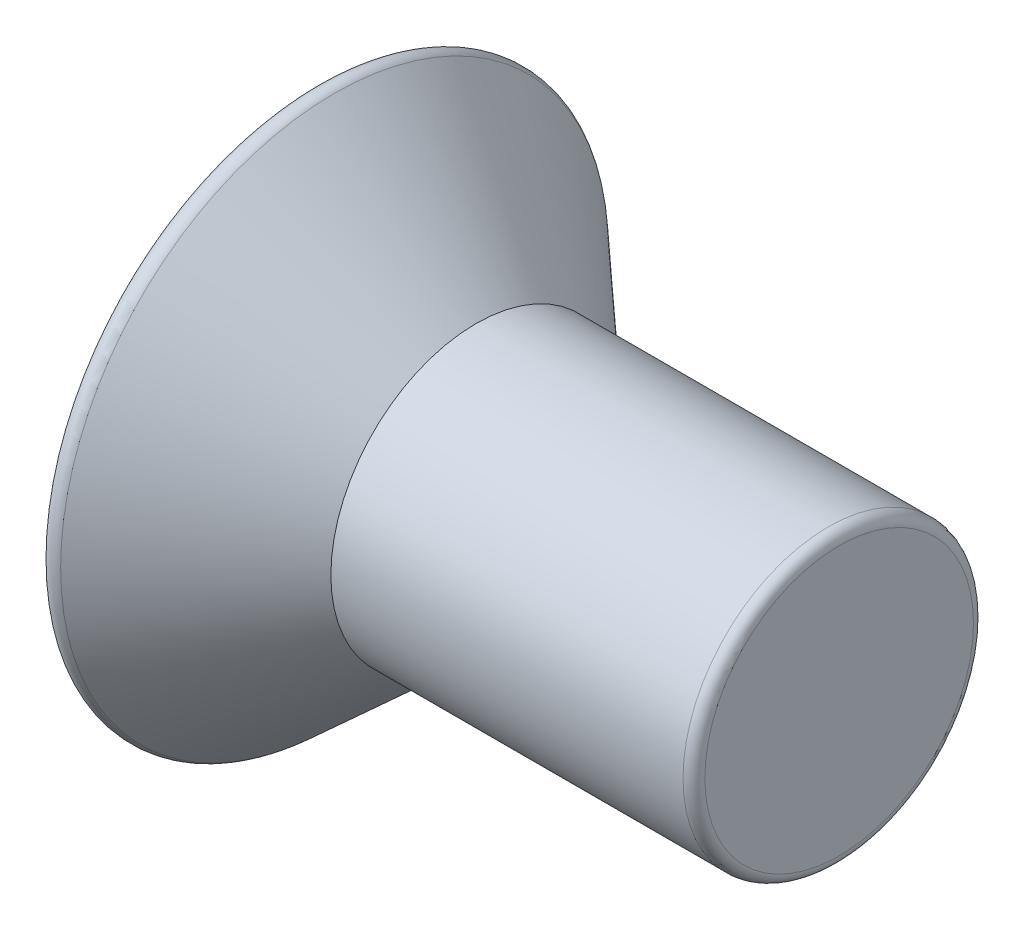
ISO-10303-21;
HEADER;
FILE_DESCRIPTION(('STEP AP214'),'2;1');
FILE_NAME('part.step','',(''),(''),'','','');
FILE_SCHEMA(('AUTOMOTIVE_DESIGN { 1 0 10303 214 1 1 1 1 }'));
ENDSEC;
DATA;
#1=APPLICATION_CONTEXT('core data for automotive mechanical design processes');
#2=APPLICATION_PROTOCOL_DEFINITION('international standard','automotive_design',2000,#1);
#3=PRODUCT_CONTEXT('',#1,'mechanical');
#4=PRODUCT('Part','Part','',(#3));
#5=PRODUCT_RELATED_PRODUCT_CATEGORY('part','',(#4));
#6=PRODUCT_DEFINITION_FORMATION('','',#4);
#7=PRODUCT_DEFINITION_CONTEXT('part definition',#1,'design');
#8=PRODUCT_DEFINITION('design','',#6,#7);
#9=PRODUCT_DEFINITION_SHAPE('','',#8);
#10=(LENGTH_UNIT() NAMED_UNIT(*) SI_UNIT(.MILLI.,.METRE.));
#11=(NAMED_UNIT(*) PLANE_ANGLE_UNIT() SI_UNIT($,.RADIAN.));
#12=(NAMED_UNIT(*) SI_UNIT($,.STERADIAN.) SOLID_ANGLE_UNIT());
#13=UNCERTAINTY_MEASURE_WITH_UNIT(LENGTH_MEASURE(1.E-05),#10,'distance_accuracy_value','');
#14=(GEOMETRIC_REPRESENTATION_CONTEXT(3) GLOBAL_UNCERTAINTY_ASSIGNED_CONTEXT((#13)) GLOBAL_UNIT_ASSIGNED_CONTEXT((#10,
#11,#12)) REPRESENTATION_CONTEXT('',''));
#15=CARTESIAN_POINT('',(0.,0.,0.));
#16=DIRECTION('',(0.,0.,1.));
#17=DIRECTION('',(1.,0.,0.));
#18=AXIS2_PLACEMENT_3D('',#15,#16,#17);
#19=CARTESIAN_POINT('',(0.,0.,0.));
#20=DIRECTION('',(-1.,0.,0.));
#21=DIRECTION('',(0.,0.,1.));
#22=AXIS2_PLACEMENT_3D('',#19,#20,#21);
#23=PLANE('',#22);
#24=CARTESIAN_POINT('',(0.,0.,0.));
#25=DIRECTION('',(-1.,0.,0.));
#26=DIRECTION('',(0.,0.,1.));
#27=AXIS2_PLACEMENT_3D('',#24,#25,#26);
#28=CIRCLE('',#27,3.7);
#29=CARTESIAN_POINT('',(0.,0.,3.7));
#30=VERTEX_POINT('',#29);
#31=EDGE_CURVE('E151',#30,#30,#28,.F.);
#32=ORIENTED_EDGE('',*,*,#31,.T.);
#33=EDGE_LOOP('',(#32));
#34=FACE_BOUND('',#33,.T.);
#35=ADVANCED_FACE('F38',(#34),#23,.F.);
#36=CARTESIAN_POINT('',(-14.4,0.,0.));
#37=DIRECTION('',(-1.,0.,0.));
#38=DIRECTION('',(0.,0.,1.));
#39=AXIS2_PLACEMENT_3D('',#36,#37,#38);
#40=CYLINDRICAL_SURFACE('',#39,4.);
#41=CARTESIAN_POINT('',(-0.3,0.,0.));
#42=DIRECTION('',(-1.,0.,0.));
#43=DIRECTION('',(0.,0.,1.));
#44=AXIS2_PLACEMENT_3D('',#41,#42,#43);
#45=CIRCLE('',#44,4.);
#46=CARTESIAN_POINT('',(-0.3,0.,4.));
#47=VERTEX_POINT('',#46);
#48=EDGE_CURVE('E148',#47,#47,#45,.T.);
#49=ORIENTED_EDGE('',*,*,#48,.T.);
#50=EDGE_LOOP('',(#49));
#51=FACE_BOUND('',#50,.T.);
#52=CARTESIAN_POINT('',(-10.,0.,0.));
#53=DIRECTION('',(-1.,0.,0.));
#54=DIRECTION('',(0.,0.,1.));
#55=AXIS2_PLACEMENT_3D('',#52,#53,#54);
#56=CIRCLE('',#55,4.);
#57=CARTESIAN_POINT('',(-10.,0.,4.));
#58=VERTEX_POINT('',#57);
#59=EDGE_CURVE('E140',#58,#58,#56,.T.);
#60=ORIENTED_EDGE('',*,*,#59,.F.);
#61=EDGE_LOOP('',(#60));
#62=FACE_BOUND('',#61,.T.);
#63=ADVANCED_FACE('F168',(#51,#62),#40,.T.);
#64=CARTESIAN_POINT('',(-10.,0.,0.));
#65=DIRECTION('',(-1.,0.,0.));
#66=DIRECTION('',(0.,0.,1.));
#67=AXIS2_PLACEMENT_3D('',#64,#65,#66);
#68=CONICAL_SURFACE('',#67,4.,0.737815060120465);
#69=CARTESIAN_POINT('',(-13.8981981618011,0.,0.));
#70=DIRECTION('',(1.,0.,0.));
#71=DIRECTION('',(0.,0.,-1.));
#72=AXIS2_PLACEMENT_3D('',#69,#70,#71);
#73=CIRCLE('',#72,7.54381651072828);
#74=CARTESIAN_POINT('',(-13.8981981618011,0.,-7.54381651072828));
#75=VERTEX_POINT('',#74);
#76=EDGE_CURVE('E11',#75,#75,#73,.T.);
#77=ORIENTED_EDGE('',*,*,#76,.T.);
#78=EDGE_LOOP('',(#77));
#79=FACE_BOUND('',#78,.T.);
#80=ORIENTED_EDGE('',*,*,#59,.T.);
#81=EDGE_LOOP('',(#80));
#82=FACE_BOUND('',#81,.T.);
#83=ADVANCED_FACE('F174',(#79,#82),#68,.T.);
#84=CARTESIAN_POINT('',(-14.4,8.,0.));
#85=DIRECTION('',(1.,0.,0.));
#86=DIRECTION('',(0.,0.,-1.));
#87=AXIS2_PLACEMENT_3D('',#84,#85,#86);
#88=PLANE('',#87);
#89=CARTESIAN_POINT('',(-14.4,0.,0.));
#90=DIRECTION('',(1.,0.,0.));
#91=DIRECTION('',(0.,0.,-1.));
#92=AXIS2_PLACEMENT_3D('',#89,#90,#91);
#93=CIRCLE('',#92,7.3218344887095);
#94=CARTESIAN_POINT('',(-14.4,0.,-7.3218344887095));
#95=VERTEX_POINT('',#94);
#96=EDGE_CURVE('E46',#95,#95,#93,.F.);
#97=ORIENTED_EDGE('',*,*,#96,.T.);
#98=EDGE_LOOP('',(#97));
#99=FACE_BOUND('',#98,.T.);
#100=DIRECTION('',(0.,0.866025403784438,-0.5));
#101=VECTOR('',#100,1.);
#102=CARTESIAN_POINT('',(-14.4,0.,2.88675134594813));
#103=LINE('',#102,#101);
#104=CARTESIAN_POINT('',(-14.4,0.,2.88675134594813));
#105=VERTEX_POINT('',#104);
#106=CARTESIAN_POINT('',(-14.4,2.5,1.44337567297406));
#107=VERTEX_POINT('',#106);
#108=EDGE_CURVE('E127',#105,#107,#103,.T.);
#109=ORIENTED_EDGE('',*,*,#108,.F.);
#110=DIRECTION('',(0.,0.866025403784439,0.5));
#111=VECTOR('',#110,1.);
#112=CARTESIAN_POINT('',(-14.4,-2.5,1.44337567297406));
#113=LINE('',#112,#111);
#114=CARTESIAN_POINT('',(-14.4,-2.5,1.44337567297406));
#115=VERTEX_POINT('',#114);
#116=EDGE_CURVE('E53',#115,#105,#113,.T.);
#117=ORIENTED_EDGE('',*,*,#116,.F.);
#118=DIRECTION('',(0.,0.,1.));
#119=VECTOR('',#118,1.);
#120=CARTESIAN_POINT('',(-14.4,-2.5,-1.44337567297407));
#121=LINE('',#120,#119);
#122=CARTESIAN_POINT('',(-14.4,-2.5,-1.44337567297407));
#123=VERTEX_POINT('',#122);
#124=EDGE_CURVE('E136',#123,#115,#121,.T.);
#125=ORIENTED_EDGE('',*,*,#124,.F.);
#126=DIRECTION('',(0.,-0.866025403784439,0.5));
#127=VECTOR('',#126,1.);
#128=CARTESIAN_POINT('',(-14.4,0.,-2.88675134594813));
#129=LINE('',#128,#127);
#130=CARTESIAN_POINT('',(-14.4,0.,-2.88675134594813));
#131=VERTEX_POINT('',#130);
#132=EDGE_CURVE('E134',#131,#123,#129,.T.);
#133=ORIENTED_EDGE('',*,*,#132,.F.);
#134=DIRECTION('',(0.,-0.866025403784439,-0.5));
#135=VECTOR('',#134,1.);
#136=CARTESIAN_POINT('',(-14.4,2.5,-1.44337567297407));
#137=LINE('',#136,#135);
#138=CARTESIAN_POINT('',(-14.4,2.5,-1.44337567297407));
#139=VERTEX_POINT('',#138);
#140=EDGE_CURVE('E101',#139,#131,#137,.T.);
#141=ORIENTED_EDGE('',*,*,#140,.F.);
#142=DIRECTION('',(0.,0.,-1.));
#143=VECTOR('',#142,1.);
#144=CARTESIAN_POINT('',(-14.4,2.5,1.44337567297406));
#145=LINE('',#144,#143);
#146=EDGE_CURVE('E130',#107,#139,#145,.T.);
#147=ORIENTED_EDGE('',*,*,#146,.F.);
#148=EDGE_LOOP('',(#109,#117,#125,#133,#141,#147));
#149=FACE_BOUND('',#148,.T.);
#150=ADVANCED_FACE('F156',(#99,#149),#88,.F.);
#151=CARTESIAN_POINT('',(-9.4,-2.5,1.44337567297406));
#152=DIRECTION('',(0.,-0.5,0.866025403784439));
#153=DIRECTION('',(0.,-0.866025403784439,-0.5));
#154=AXIS2_PLACEMENT_3D('',#151,#152,#153);
#155=PLANE('',#154);
#156=ORIENTED_EDGE('',*,*,#116,.T.);
#157=DIRECTION('',(-1.,0.,0.));
#158=VECTOR('',#157,1.);
#159=CARTESIAN_POINT('',(-9.4,0.,2.88675134594813));
#160=LINE('',#159,#158);
#161=CARTESIAN_POINT('',(-9.4,0.,2.88675134594813));
#162=VERTEX_POINT('',#161);
#163=EDGE_CURVE('E83',#162,#105,#160,.T.);
#164=ORIENTED_EDGE('',*,*,#163,.F.);
#165=DIRECTION('',(0.,0.866025403784439,0.5));
#166=VECTOR('',#165,1.);
#167=CARTESIAN_POINT('',(-9.4,-2.5,1.44337567297406));
#168=LINE('',#167,#166);
#169=CARTESIAN_POINT('',(-9.4,-2.5,1.44337567297406));
#170=VERTEX_POINT('',#169);
#171=EDGE_CURVE('E138',#170,#162,#168,.T.);
#172=ORIENTED_EDGE('',*,*,#171,.F.);
#173=DIRECTION('',(-1.,0.,0.));
#174=VECTOR('',#173,1.);
#175=CARTESIAN_POINT('',(-9.4,-2.5,1.44337567297406));
#176=LINE('',#175,#174);
#177=EDGE_CURVE('E61',#170,#115,#176,.T.);
#178=ORIENTED_EDGE('',*,*,#177,.T.);
#179=EDGE_LOOP('',(#156,#164,#172,#178));
#180=FACE_BOUND('',#179,.T.);
#181=ADVANCED_FACE('F183',(#180),#155,.F.);
#182=CARTESIAN_POINT('',(-9.4,-2.5,-1.44337567297407));
#183=DIRECTION('',(0.,-1.,0.));
#184=DIRECTION('',(0.,0.,-1.));
#185=AXIS2_PLACEMENT_3D('',#182,#183,#184);
#186=PLANE('',#185);
#187=ORIENTED_EDGE('',*,*,#124,.T.);
#188=ORIENTED_EDGE('',*,*,#177,.F.);
#189=DIRECTION('',(0.,0.,1.));
#190=VECTOR('',#189,1.);
#191=CARTESIAN_POINT('',(-9.4,-2.5,-1.44337567297407));
#192=LINE('',#191,#190);
#193=CARTESIAN_POINT('',(-9.4,-2.5,-1.44337567297407));
#194=VERTEX_POINT('',#193);
#195=EDGE_CURVE('E113',#194,#170,#192,.T.);
#196=ORIENTED_EDGE('',*,*,#195,.F.);
#197=DIRECTION('',(-1.,0.,0.));
#198=VECTOR('',#197,1.);
#199=CARTESIAN_POINT('',(-9.4,-2.5,-1.44337567297407));
#200=LINE('',#199,#198);
#201=EDGE_CURVE('E105',#194,#123,#200,.T.);
#202=ORIENTED_EDGE('',*,*,#201,.T.);
#203=EDGE_LOOP('',(#187,#188,#196,#202));
#204=FACE_BOUND('',#203,.T.);
#205=ADVANCED_FACE('F186',(#204),#186,.F.);
#206=CARTESIAN_POINT('',(-9.4,0.,-2.88675134594813));
#207=DIRECTION('',(0.,-0.5,-0.866025403784439));
#208=DIRECTION('',(0.,0.866025403784439,-0.5));
#209=AXIS2_PLACEMENT_3D('',#206,#207,#208);
#210=PLANE('',#209);
#211=ORIENTED_EDGE('',*,*,#132,.T.);
#212=ORIENTED_EDGE('',*,*,#201,.F.);
#213=DIRECTION('',(0.,-0.866025403784439,0.5));
#214=VECTOR('',#213,1.);
#215=CARTESIAN_POINT('',(-9.4,0.,-2.88675134594813));
#216=LINE('',#215,#214);
#217=CARTESIAN_POINT('',(-9.4,0.,-2.88675134594813));
#218=VERTEX_POINT('',#217);
#219=EDGE_CURVE('E109',#218,#194,#216,.T.);
#220=ORIENTED_EDGE('',*,*,#219,.F.);
#221=DIRECTION('',(-1.,0.,0.));
#222=VECTOR('',#221,1.);
#223=CARTESIAN_POINT('',(-9.4,0.,-2.88675134594813));
#224=LINE('',#223,#222);
#225=EDGE_CURVE('E94',#218,#131,#224,.T.);
#226=ORIENTED_EDGE('',*,*,#225,.T.);
#227=EDGE_LOOP('',(#211,#212,#220,#226));
#228=FACE_BOUND('',#227,.T.);
#229=ADVANCED_FACE('F110',(#228),#210,.F.);
#230=CARTESIAN_POINT('',(-9.4,2.5,-1.44337567297407));
#231=DIRECTION('',(0.,0.5,-0.866025403784439));
#232=DIRECTION('',(0.,0.866025403784439,0.5));
#233=AXIS2_PLACEMENT_3D('',#230,#231,#232);
#234=PLANE('',#233);
#235=ORIENTED_EDGE('',*,*,#140,.T.);
#236=ORIENTED_EDGE('',*,*,#225,.F.);
#237=DIRECTION('',(0.,-0.866025403784439,-0.5));
#238=VECTOR('',#237,1.);
#239=CARTESIAN_POINT('',(-9.4,2.5,-1.44337567297407));
#240=LINE('',#239,#238);
#241=CARTESIAN_POINT('',(-9.4,2.5,-1.44337567297407));
#242=VERTEX_POINT('',#241);
#243=EDGE_CURVE('E98',#242,#218,#240,.T.);
#244=ORIENTED_EDGE('',*,*,#243,.F.);
#245=DIRECTION('',(-1.,0.,0.));
#246=VECTOR('',#245,1.);
#247=CARTESIAN_POINT('',(-9.4,2.5,-1.44337567297407));
#248=LINE('',#247,#246);
#249=EDGE_CURVE('E106',#242,#139,#248,.T.);
#250=ORIENTED_EDGE('',*,*,#249,.T.);
#251=EDGE_LOOP('',(#235,#236,#244,#250));
#252=FACE_BOUND('',#251,.T.);
#253=ADVANCED_FACE('F96',(#252),#234,.F.);
#254=CARTESIAN_POINT('',(-9.4,2.5,1.44337567297406));
#255=DIRECTION('',(0.,1.,0.));
#256=DIRECTION('',(0.,0.,1.));
#257=AXIS2_PLACEMENT_3D('',#254,#255,#256);
#258=PLANE('',#257);
#259=ORIENTED_EDGE('',*,*,#146,.T.);
#260=ORIENTED_EDGE('',*,*,#249,.F.);
#261=DIRECTION('',(0.,0.,-1.));
#262=VECTOR('',#261,1.);
#263=CARTESIAN_POINT('',(-9.4,2.5,1.44337567297406));
#264=LINE('',#263,#262);
#265=CARTESIAN_POINT('',(-9.4,2.5,1.44337567297406));
#266=VERTEX_POINT('',#265);
#267=EDGE_CURVE('E119',#266,#242,#264,.T.);
#268=ORIENTED_EDGE('',*,*,#267,.F.);
#269=DIRECTION('',(-1.,0.,0.));
#270=VECTOR('',#269,1.);
#271=CARTESIAN_POINT('',(-9.4,2.5,1.44337567297406));
#272=LINE('',#271,#270);
#273=EDGE_CURVE('E143',#266,#107,#272,.T.);
#274=ORIENTED_EDGE('',*,*,#273,.T.);
#275=EDGE_LOOP('',(#259,#260,#268,#274));
#276=FACE_BOUND('',#275,.T.);
#277=ADVANCED_FACE('F190',(#276),#258,.F.);
#278=CARTESIAN_POINT('',(-9.4,0.,2.88675134594813));
#279=DIRECTION('',(0.,0.5,0.866025403784439));
#280=DIRECTION('',(0.,-0.866025403784439,0.5));
#281=AXIS2_PLACEMENT_3D('',#278,#279,#280);
#282=PLANE('',#281);
#283=ORIENTED_EDGE('',*,*,#108,.T.);
#284=ORIENTED_EDGE('',*,*,#273,.F.);
#285=DIRECTION('',(0.,0.866025403784438,-0.5));
#286=VECTOR('',#285,1.);
#287=CARTESIAN_POINT('',(-9.4,0.,2.88675134594813));
#288=LINE('',#287,#286);
#289=EDGE_CURVE('E121',#162,#266,#288,.T.);
#290=ORIENTED_EDGE('',*,*,#289,.F.);
#291=ORIENTED_EDGE('',*,*,#163,.T.);
#292=EDGE_LOOP('',(#283,#284,#290,#291));
#293=FACE_BOUND('',#292,.T.);
#294=ADVANCED_FACE('F187',(#293),#282,.F.);
#295=CARTESIAN_POINT('',(-9.4,0.,0.));
#296=DIRECTION('',(-1.,0.,0.));
#297=DIRECTION('',(0.,0.,1.));
#298=AXIS2_PLACEMENT_3D('',#295,#296,#297);
#299=PLANE('',#298);
#300=ORIENTED_EDGE('',*,*,#171,.T.);
#301=ORIENTED_EDGE('',*,*,#289,.T.);
#302=ORIENTED_EDGE('',*,*,#267,.T.);
#303=ORIENTED_EDGE('',*,*,#243,.T.);
#304=ORIENTED_EDGE('',*,*,#219,.T.);
#305=ORIENTED_EDGE('',*,*,#195,.T.);
#306=EDGE_LOOP('',(#300,#301,#302,#303,#304,#305));
#307=FACE_BOUND('',#306,.T.);
#308=ADVANCED_FACE('F116',(#307),#299,.T.);
#309=CARTESIAN_POINT('',(-0.3,0.,0.));
#310=DIRECTION('',(-1.,0.,0.));
#311=DIRECTION('',(0.,0.,1.));
#312=AXIS2_PLACEMENT_3D('',#309,#310,#311);
#313=TOROIDAL_SURFACE('',#312,3.7,0.3);
#314=ORIENTED_EDGE('',*,*,#31,.F.);
#315=EDGE_LOOP('',(#314));
#316=FACE_BOUND('',#315,.T.);
#317=ORIENTED_EDGE('',*,*,#48,.F.);
#318=EDGE_LOOP('',(#317));
#319=FACE_BOUND('',#318,.T.);
#320=ADVANCED_FACE('F160',(#316,#319),#313,.T.);
#321=CARTESIAN_POINT('',(-14.1,0.,0.));
#322=DIRECTION('',(1.,0.,0.));
#323=DIRECTION('',(0.,0.,-1.));
#324=AXIS2_PLACEMENT_3D('',#321,#322,#323);
#325=TOROIDAL_SURFACE('',#324,7.3218344887095,0.3);
#326=ORIENTED_EDGE('',*,*,#76,.F.);
#327=EDGE_LOOP('',(#326));
#328=FACE_BOUND('',#327,.T.);
#329=ORIENTED_EDGE('',*,*,#96,.F.);
#330=EDGE_LOOP('',(#329));
#331=FACE_BOUND('',#330,.T.);
#332=ADVANCED_FACE('F40',(#328,#331),#325,.T.);
#333=CLOSED_SHELL('',(#35,#63,#83,#150,#181,#205,#229,#253,#277,#294,#308,#320,#332));
#334=MANIFOLD_SOLID_BREP('B2',#333);
#335=ADVANCED_BREP_SHAPE_REPRESENTATION('',(#18,#334),#14);
#336=SHAPE_DEFINITION_REPRESENTATION(#9,#335);
ENDSEC;
END-ISO-10303-21;
